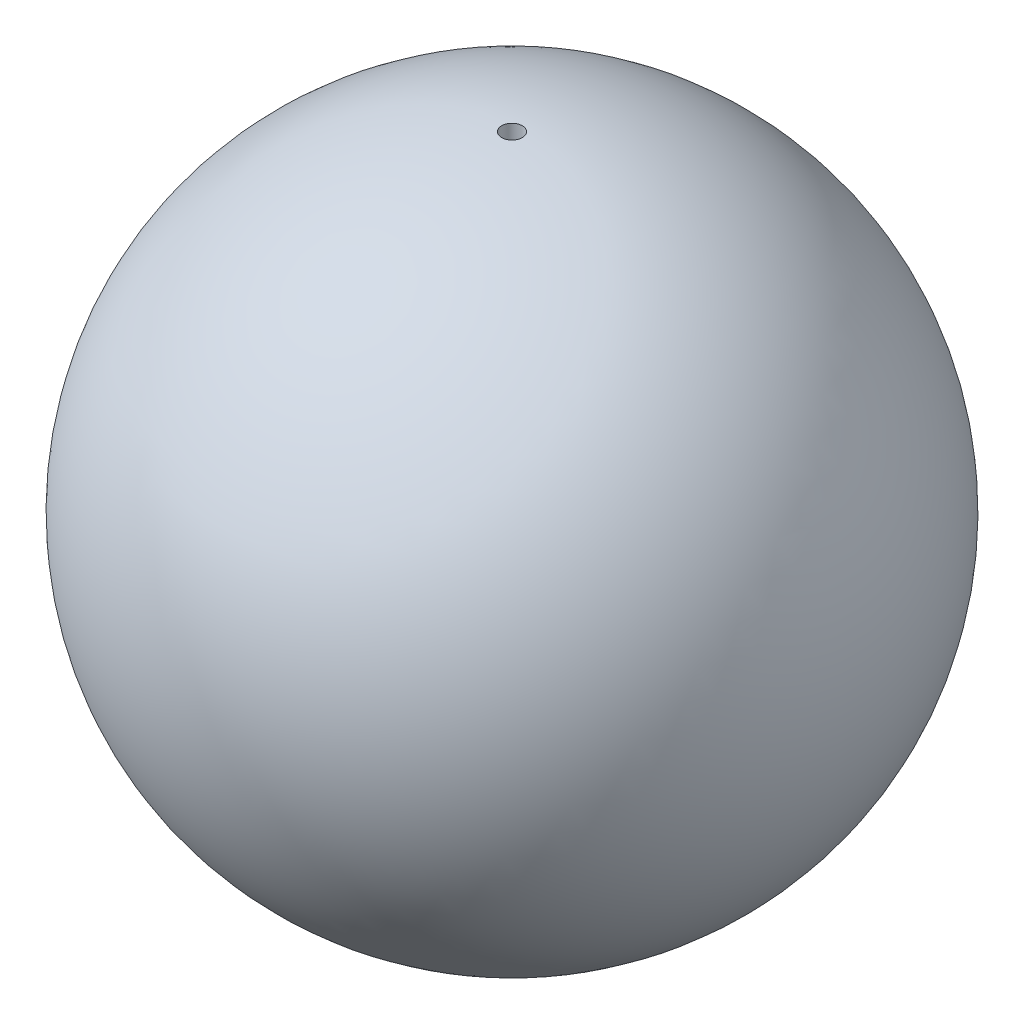
ISO-10303-21;
HEADER;
FILE_DESCRIPTION(('STEP AP214'),'2;1');
FILE_NAME('part.step','',(''),(''),'','','');
FILE_SCHEMA(('AUTOMOTIVE_DESIGN { 1 0 10303 214 1 1 1 1 }'));
ENDSEC;
DATA;
#1=APPLICATION_CONTEXT('core data for automotive mechanical design processes');
#2=APPLICATION_PROTOCOL_DEFINITION('international standard','automotive_design',2000,#1);
#3=PRODUCT_CONTEXT('',#1,'mechanical');
#4=PRODUCT('Part','Part','',(#3));
#5=PRODUCT_RELATED_PRODUCT_CATEGORY('part','',(#4));
#6=PRODUCT_DEFINITION_FORMATION('','',#4);
#7=PRODUCT_DEFINITION_CONTEXT('part definition',#1,'design');
#8=PRODUCT_DEFINITION('design','',#6,#7);
#9=PRODUCT_DEFINITION_SHAPE('','',#8);
#10=(LENGTH_UNIT() NAMED_UNIT(*) SI_UNIT(.MILLI.,.METRE.));
#11=(NAMED_UNIT(*) PLANE_ANGLE_UNIT() SI_UNIT($,.RADIAN.));
#12=(NAMED_UNIT(*) SI_UNIT($,.STERADIAN.) SOLID_ANGLE_UNIT());
#13=UNCERTAINTY_MEASURE_WITH_UNIT(LENGTH_MEASURE(1.E-05),#10,'distance_accuracy_value','');
#14=(GEOMETRIC_REPRESENTATION_CONTEXT(3) GLOBAL_UNCERTAINTY_ASSIGNED_CONTEXT((#13)) GLOBAL_UNIT_ASSIGNED_CONTEXT((#10,
#11,#12)) REPRESENTATION_CONTEXT('',''));
#15=CARTESIAN_POINT('',(0.,0.,0.));
#16=DIRECTION('',(0.,0.,1.));
#17=DIRECTION('',(1.,0.,0.));
#18=AXIS2_PLACEMENT_3D('',#15,#16,#17);
#19=CARTESIAN_POINT('',(0.,0.,0.));
#20=DIRECTION('',(0.,1.,0.));
#21=DIRECTION('',(1.,0.,0.));
#22=AXIS2_PLACEMENT_3D('',#19,#20,#21);
#23=SPHERICAL_SURFACE('',#22,203.2);
#24=CARTESIAN_POINT('',(0.,203.100757014837,0.));
#25=DIRECTION('',(0.,-1.,0.));
#26=DIRECTION('',(0.,0.,-1.));
#27=AXIS2_PLACEMENT_3D('',#24,#25,#26);
#28=CIRCLE('',#27,6.35);
#29=CARTESIAN_POINT('',(6.34999999999946,203.100757014837,0.));
#30=VERTEX_POINT('',#29);
#31=EDGE_CURVE('E10',#30,#30,#28,.F.);
#32=CARTESIAN_POINT('',(0.,-203.100757014837,0.));
#33=DIRECTION('',(0.,1.,0.));
#34=DIRECTION('',(0.,0.,1.));
#35=AXIS2_PLACEMENT_3D('',#32,#33,#34);
#36=CIRCLE('',#35,6.35);
#37=CARTESIAN_POINT('',(6.34999999999946,-203.100757014837,0.));
#38=VERTEX_POINT('',#37);
#39=EDGE_CURVE('E39',#38,#38,#36,.F.);
#40=CARTESIAN_POINT('',(6.34999999999946,203.100757014837,0.));
#41=CARTESIAN_POINT('',(7.97855225831806,203.049843962054,0.));
#42=CARTESIAN_POINT('',(9.60649168306472,202.979335242005,0.));
#43=CARTESIAN_POINT('',(12.8602038778124,202.799185124185,0.));
#44=CARTESIAN_POINT('',(14.4859766478133,202.689543726414,0.));
#45=CARTESIAN_POINT('',(17.7344145454678,202.431186909963,0.));
#46=CARTESIAN_POINT('',(19.3570796731212,202.282471491281,0.));
#47=CARTESIAN_POINT('',(22.5983634325835,201.946053966539,0.));
#48=CARTESIAN_POINT('',(24.2169820643923,201.758351860478,0.));
#49=CARTESIAN_POINT('',(27.4492362300853,201.344069227695,0.));
#50=CARTESIAN_POINT('',(29.0628717639695,201.117488700973,0.));
#51=CARTESIAN_POINT('',(32.2842260392271,200.625580425459,0.));
#52=CARTESIAN_POINT('',(33.8919447806004,200.360252676667,0.));
#53=CARTESIAN_POINT('',(37.1005351934276,199.791003459231,0.));
#54=CARTESIAN_POINT('',(38.7014068648815,199.487081990587,0.));
#55=CARTESIAN_POINT('',(41.8953768241203,198.840821198467,0.));
#56=CARTESIAN_POINT('',(43.4884751119052,198.49848187499,0.));
#57=CARTESIAN_POINT('',(46.665976487514,197.775583459607,0.));
#58=CARTESIAN_POINT('',(48.2503795753379,197.395024367701,0.));
#59=CARTESIAN_POINT('',(51.40957376617,196.595906619255,0.));
#60=CARTESIAN_POINT('',(52.9843648691782,196.177347962716,0.));
#61=CARTESIAN_POINT('',(56.123423867284,195.302473275927,0.));
#62=CARTESIAN_POINT('',(57.6876917623816,194.846157245677,0.));
#63=CARTESIAN_POINT('',(60.8047992106357,193.896031850142,0.));
#64=CARTESIAN_POINT('',(62.3576387637922,193.402222484857,0.));
#65=CARTESIAN_POINT('',(65.4509910069248,192.377396152691,0.));
#66=CARTESIAN_POINT('',(66.991503696901,191.846379185811,0.));
#67=CARTESIAN_POINT('',(70.0593108251408,190.747444913383,0.));
#68=CARTESIAN_POINT('',(71.5866052634044,190.179527607835,0.));
#69=CARTESIAN_POINT('',(74.6270921481781,189.007121272679,0.));
#70=CARTESIAN_POINT('',(76.1402845946881,188.402632243071,0.));
#71=CARTESIAN_POINT('',(79.1516919157645,187.157432235938,0.));
#72=CARTESIAN_POINT('',(80.6499067903308,186.516721258414,0.));
#73=CARTESIAN_POINT('',(83.6304920538181,185.199448090738,0.));
#74=CARTESIAN_POINT('',(85.1128624427392,184.522885900587,0.));
#75=CARTESIAN_POINT('',(88.0609009893466,183.134301787574,0.));
#76=CARTESIAN_POINT('',(89.5265691470329,182.422279864712,0.));
#77=CARTESIAN_POINT('',(92.4403551500115,180.963188284296,0.));
#78=CARTESIAN_POINT('',(93.8884729953038,180.216118626742,0.));
#79=CARTESIAN_POINT('',(96.7663204474914,178.68736385467,0.));
#80=CARTESIAN_POINT('',(98.1960500543867,177.905678740152,0.));
#81=CARTESIAN_POINT('',(101.036293743784,176.30814536146,0.));
#82=CARTESIAN_POINT('',(102.446807826285,175.492297097286,0.));
#83=CARTESIAN_POINT('',(105.247804299598,173.826909494449,0.));
#84=CARTESIAN_POINT('',(106.63828669041,172.977370155786,0.));
#85=CARTESIAN_POINT('',(109.398415204005,171.245091973843,0.));
#86=CARTESIAN_POINT('',(110.768061326788,170.362353130563,0.));
#87=CARTESIAN_POINT('',(113.485724784503,168.564186719522,0.));
#88=CARTESIAN_POINT('',(114.833742119434,167.648759151761,0.));
#89=CARTESIAN_POINT('',(117.507367996708,165.785744986606,0.));
#90=CARTESIAN_POINT('',(118.832976539051,164.838158389213,0.));
#91=CARTESIAN_POINT('',(121.461017792836,162.911374467856,0.));
#92=CARTESIAN_POINT('',(122.763450504279,161.932177143893,0.));
#93=CARTESIAN_POINT('',(125.344386468208,159.94273836341,0.));
#94=CARTESIAN_POINT('',(126.622889720695,158.932496906889,0.));
#95=CARTESIAN_POINT('',(129.155226984986,156.881554418403,0.));
#96=CARTESIAN_POINT('',(130.409060996791,155.840853386438,0.));
#97=CARTESIAN_POINT('',(132.89133427238,153.72959392903,0.));
#98=CARTESIAN_POINT('',(134.119773536164,152.659035503588,0.));
#99=CARTESIAN_POINT('',(136.550546502567,150.488680717614,0.));
#100=CARTESIAN_POINT('',(137.752880205185,149.388884357082,0.));
#101=CARTESIAN_POINT('',(140.130746341598,147.160690077291,0.));
#102=CARTESIAN_POINT('',(141.306278775393,146.032292158031,0.));
#103=CARTESIAN_POINT('',(143.629862174549,143.747547686901,0.));
#104=CARTESIAN_POINT('',(144.77791313991,142.591201135029,0.));
#105=CARTESIAN_POINT('',(147.045869304221,140.251228496736,0.));
#106=CARTESIAN_POINT('',(148.165774503171,139.067602410315,0.));
#107=CARTESIAN_POINT('',(150.376791122696,136.673755585771,0.));
#108=CARTESIAN_POINT('',(151.467902543271,135.463534847648,0.));
#109=CARTESIAN_POINT('',(153.62070025506,133.017198991043,0.));
#110=CARTESIAN_POINT('',(154.682386546274,131.781083872561,0.));
#111=CARTESIAN_POINT('',(156.775719674647,129.283674509871,0.));
#112=CARTESIAN_POINT('',(157.807366511807,128.022380265664,0.));
#113=CARTESIAN_POINT('',(159.84002378914,125.475342475583,0.));
#114=CARTESIAN_POINT('',(160.841034229314,124.18959892971,0.));
#115=CARTESIAN_POINT('',(162.811839496919,121.594406507484,0.));
#116=CARTESIAN_POINT('',(163.781634324349,120.284957631131,0.));
#117=CARTESIAN_POINT('',(165.689447213029,117.643112235772,0.));
#118=CARTESIAN_POINT('',(166.62746527428,116.310715716766,0.));
#119=CARTESIAN_POINT('',(168.471181864191,113.623746002147,0.));
#120=CARTESIAN_POINT('',(169.376880392852,112.269172806534,0.));
#121=CARTESIAN_POINT('',(171.155433852259,109.538633536861,0.));
#122=CARTESIAN_POINT('',(172.028288783006,108.162667462801,0.));
#123=CARTESIAN_POINT('',(173.740649985588,105.390138612981,0.));
#124=CARTESIAN_POINT('',(174.580156257423,103.99357583722,0.));
#125=CARTESIAN_POINT('',(176.225334377755,101.180661678634,0.));
#126=CARTESIAN_POINT('',(177.031006226253,99.7643102958083,0.));
#127=CARTESIAN_POINT('',(178.608049313131,96.9126384680338,0.));
#128=CARTESIAN_POINT('',(179.379420551513,95.4773180230845,0.));
#129=CARTESIAN_POINT('',(180.887416078783,92.5885385920912,0.));
#130=CARTESIAN_POINT('',(181.624040367671,91.1350796060471,0.));
#131=CARTESIAN_POINT('',(183.06211576224,88.2108641094173,0.));
#132=CARTESIAN_POINT('',(183.763566867921,86.7401075988316,0.));
#133=CARTESIAN_POINT('',(185.130890014661,83.7821480785568,0.));
#134=CARTESIAN_POINT('',(185.79676205572,82.2949450688677,0.));
#135=CARTESIAN_POINT('',(187.092541778952,79.3049530922806,0.));
#136=CARTESIAN_POINT('',(187.722449461126,77.8021641253824,0.));
#137=CARTESIAN_POINT('',(188.94593598242,74.7818697947905,0.));
#138=CARTESIAN_POINT('',(189.539514821541,73.2643644310967,0.));
#139=CARTESIAN_POINT('',(190.690000193562,70.2155153826915,0.));
#140=CARTESIAN_POINT('',(191.246906726462,68.6841716979802,0.));
#141=CARTESIAN_POINT('',(192.323725242609,65.608532090601,0.));
#142=CARTESIAN_POINT('',(192.843637225855,64.0642361679331,0.));
#143=CARTESIAN_POINT('',(193.846165805458,60.963585662269,0.));
#144=CARTESIAN_POINT('',(194.328782401814,59.4072310792729,0.));
#145=CARTESIAN_POINT('',(195.256440950672,56.2833638080966,0.));
#146=CARTESIAN_POINT('',(195.701482903173,54.7158511199164,0.));
#147=CARTESIAN_POINT('',(196.553734649211,51.5705746499427,0.));
#148=CARTESIAN_POINT('',(196.960944442748,49.9928108681491,0.));
#149=CARTESIAN_POINT('',(197.737296246612,46.8279451541207,0.));
#150=CARTESIAN_POINT('',(198.106438256939,45.2408432218859,0.));
#151=CARTESIAN_POINT('',(198.806440897341,42.0582195534913,0.));
#152=CARTESIAN_POINT('',(199.137301527416,40.4626978173316,0.));
#153=CARTESIAN_POINT('',(199.760549961068,37.2641577595636,0.));
#154=CARTESIAN_POINT('',(200.052937764644,35.6611394379553,0.));
#155=CARTESIAN_POINT('',(200.599071360626,32.4485337655244,0.));
#156=CARTESIAN_POINT('',(200.852817153031,30.8389464147017,0.));
#157=CARTESIAN_POINT('',(201.321519901467,27.6141340411203,0.));
#158=CARTESIAN_POINT('',(201.536476857498,25.9989090183616,0.));
#159=CARTESIAN_POINT('',(201.927477552407,22.7637559203188,0.));
#160=CARTESIAN_POINT('',(202.103521291286,21.1438278450348,0.));
#161=CARTESIAN_POINT('',(202.416593687512,17.9002059826845,0.));
#162=CARTESIAN_POINT('',(202.553622344859,16.2765121956182,0.));
#163=CARTESIAN_POINT('',(202.78858528898,13.0262984294045,0.));
#164=CARTESIAN_POINT('',(202.886519575754,11.3997784502571,0.));
#165=CARTESIAN_POINT('',(203.043237110907,8.14485345490447,0.));
#166=CARTESIAN_POINT('',(203.102020359285,6.51644843869936,0.));
#167=CARTESIAN_POINT('',(203.180401803832,3.25869561499617,0.));
#168=CARTESIAN_POINT('',(203.2,1.62934780749808,0.));
#169=CARTESIAN_POINT('',(203.2,-1.62934780749808,0.));
#170=CARTESIAN_POINT('',(203.180401803832,-3.25869561499617,0.));
#171=CARTESIAN_POINT('',(203.102020359285,-6.51644843869936,0.));
#172=CARTESIAN_POINT('',(203.043237110907,-8.14485345490447,0.));
#173=CARTESIAN_POINT('',(202.886519575754,-11.3997784502571,0.));
#174=CARTESIAN_POINT('',(202.78858528898,-13.0262984294045,0.));
#175=CARTESIAN_POINT('',(202.553622344859,-16.2765121956182,0.));
#176=CARTESIAN_POINT('',(202.416593687512,-17.9002059826845,0.));
#177=CARTESIAN_POINT('',(202.103521291286,-21.1438278450348,0.));
#178=CARTESIAN_POINT('',(201.927477552407,-22.7637559203188,0.));
#179=CARTESIAN_POINT('',(201.536476857498,-25.9989090183616,0.));
#180=CARTESIAN_POINT('',(201.321519901467,-27.6141340411203,0.));
#181=CARTESIAN_POINT('',(200.852817153031,-30.8389464147017,0.));
#182=CARTESIAN_POINT('',(200.599071360626,-32.4485337655244,0.));
#183=CARTESIAN_POINT('',(200.052937764644,-35.6611394379553,0.));
#184=CARTESIAN_POINT('',(199.760549961068,-37.2641577595636,0.));
#185=CARTESIAN_POINT('',(199.137301527416,-40.4626978173316,0.));
#186=CARTESIAN_POINT('',(198.806440897341,-42.0582195534913,0.));
#187=CARTESIAN_POINT('',(198.106438256939,-45.2408432218859,0.));
#188=CARTESIAN_POINT('',(197.737296246612,-46.8279451541207,0.));
#189=CARTESIAN_POINT('',(196.960944442748,-49.9928108681491,0.));
#190=CARTESIAN_POINT('',(196.553734649211,-51.5705746499427,0.));
#191=CARTESIAN_POINT('',(195.701482903173,-54.7158511199164,0.));
#192=CARTESIAN_POINT('',(195.256440950672,-56.2833638080966,0.));
#193=CARTESIAN_POINT('',(194.328782401814,-59.4072310792729,0.));
#194=CARTESIAN_POINT('',(193.846165805458,-60.963585662269,0.));
#195=CARTESIAN_POINT('',(192.843637225855,-64.0642361679331,0.));
#196=CARTESIAN_POINT('',(192.323725242609,-65.608532090601,0.));
#197=CARTESIAN_POINT('',(191.246906726462,-68.6841716979802,0.));
#198=CARTESIAN_POINT('',(190.690000193562,-70.2155153826915,0.));
#199=CARTESIAN_POINT('',(189.539514821541,-73.2643644310967,0.));
#200=CARTESIAN_POINT('',(188.94593598242,-74.7818697947905,0.));
#201=CARTESIAN_POINT('',(187.722449461126,-77.8021641253824,0.));
#202=CARTESIAN_POINT('',(187.092541778952,-79.3049530922806,0.));
#203=CARTESIAN_POINT('',(185.79676205572,-82.2949450688677,0.));
#204=CARTESIAN_POINT('',(185.130890014661,-83.7821480785568,0.));
#205=CARTESIAN_POINT('',(183.763566867921,-86.7401075988316,0.));
#206=CARTESIAN_POINT('',(183.06211576224,-88.2108641094173,0.));
#207=CARTESIAN_POINT('',(181.624040367671,-91.1350796060471,0.));
#208=CARTESIAN_POINT('',(180.887416078783,-92.5885385920911,0.));
#209=CARTESIAN_POINT('',(179.379420551513,-95.4773180230844,0.));
#210=CARTESIAN_POINT('',(178.608049313131,-96.9126384680337,0.));
#211=CARTESIAN_POINT('',(177.031006226253,-99.7643102958083,0.));
#212=CARTESIAN_POINT('',(176.225334377755,-101.180661678634,0.));
#213=CARTESIAN_POINT('',(174.580156257423,-103.99357583722,0.));
#214=CARTESIAN_POINT('',(173.740649985588,-105.390138612981,0.));
#215=CARTESIAN_POINT('',(172.028288783006,-108.162667462801,0.));
#216=CARTESIAN_POINT('',(171.155433852259,-109.538633536861,0.));
#217=CARTESIAN_POINT('',(169.376880392852,-112.269172806534,0.));
#218=CARTESIAN_POINT('',(168.471181864191,-113.623746002147,0.));
#219=CARTESIAN_POINT('',(166.62746527428,-116.310715716766,0.));
#220=CARTESIAN_POINT('',(165.689447213029,-117.643112235772,0.));
#221=CARTESIAN_POINT('',(163.781634324349,-120.284957631131,0.));
#222=CARTESIAN_POINT('',(162.811839496919,-121.594406507484,0.));
#223=CARTESIAN_POINT('',(160.841034229314,-124.18959892971,0.));
#224=CARTESIAN_POINT('',(159.84002378914,-125.475342475583,0.));
#225=CARTESIAN_POINT('',(157.807366511807,-128.022380265664,0.));
#226=CARTESIAN_POINT('',(156.775719674647,-129.283674509871,0.));
#227=CARTESIAN_POINT('',(154.682386546274,-131.781083872561,0.));
#228=CARTESIAN_POINT('',(153.62070025506,-133.017198991043,0.));
#229=CARTESIAN_POINT('',(151.467902543271,-135.463534847648,0.));
#230=CARTESIAN_POINT('',(150.376791122696,-136.673755585771,0.));
#231=CARTESIAN_POINT('',(148.165774503171,-139.067602410315,0.));
#232=CARTESIAN_POINT('',(147.045869304221,-140.251228496736,0.));
#233=CARTESIAN_POINT('',(144.77791313991,-142.591201135029,0.));
#234=CARTESIAN_POINT('',(143.629862174549,-143.747547686901,0.));
#235=CARTESIAN_POINT('',(141.306278775393,-146.032292158031,0.));
#236=CARTESIAN_POINT('',(140.130746341598,-147.160690077291,0.));
#237=CARTESIAN_POINT('',(137.752880205185,-149.388884357082,0.));
#238=CARTESIAN_POINT('',(136.550546502567,-150.488680717614,0.));
#239=CARTESIAN_POINT('',(134.119773536164,-152.659035503588,0.));
#240=CARTESIAN_POINT('',(132.89133427238,-153.72959392903,0.));
#241=CARTESIAN_POINT('',(130.409060996791,-155.840853386438,0.));
#242=CARTESIAN_POINT('',(129.155226984986,-156.881554418403,0.));
#243=CARTESIAN_POINT('',(126.622889720695,-158.932496906889,0.));
#244=CARTESIAN_POINT('',(125.344386468208,-159.94273836341,0.));
#245=CARTESIAN_POINT('',(122.763450504279,-161.932177143893,0.));
#246=CARTESIAN_POINT('',(121.461017792836,-162.911374467856,0.));
#247=CARTESIAN_POINT('',(118.832976539051,-164.838158389213,0.));
#248=CARTESIAN_POINT('',(117.507367996708,-165.785744986606,0.));
#249=CARTESIAN_POINT('',(114.833742119434,-167.648759151761,0.));
#250=CARTESIAN_POINT('',(113.485724784503,-168.564186719522,0.));
#251=CARTESIAN_POINT('',(110.768061326788,-170.362353130563,0.));
#252=CARTESIAN_POINT('',(109.398415204005,-171.245091973843,0.));
#253=CARTESIAN_POINT('',(106.63828669041,-172.977370155786,0.));
#254=CARTESIAN_POINT('',(105.247804299598,-173.826909494449,0.));
#255=CARTESIAN_POINT('',(102.446807826285,-175.492297097286,0.));
#256=CARTESIAN_POINT('',(101.036293743784,-176.30814536146,0.));
#257=CARTESIAN_POINT('',(98.1960500543866,-177.905678740152,0.));
#258=CARTESIAN_POINT('',(96.7663204474914,-178.68736385467,0.));
#259=CARTESIAN_POINT('',(93.8884729953038,-180.216118626742,0.));
#260=CARTESIAN_POINT('',(92.4403551500115,-180.963188284296,0.));
#261=CARTESIAN_POINT('',(89.5265691470329,-182.422279864712,0.));
#262=CARTESIAN_POINT('',(88.0609009893465,-183.134301787574,0.));
#263=CARTESIAN_POINT('',(85.1128624427392,-184.522885900587,0.));
#264=CARTESIAN_POINT('',(83.6304920538181,-185.199448090738,0.));
#265=CARTESIAN_POINT('',(80.6499067903308,-186.516721258414,0.));
#266=CARTESIAN_POINT('',(79.1516919157645,-187.157432235938,0.));
#267=CARTESIAN_POINT('',(76.1402845946881,-188.402632243071,0.));
#268=CARTESIAN_POINT('',(74.6270921481781,-189.007121272679,0.));
#269=CARTESIAN_POINT('',(71.5866052634044,-190.179527607835,0.));
#270=CARTESIAN_POINT('',(70.0593108251408,-190.747444913383,0.));
#271=CARTESIAN_POINT('',(66.991503696901,-191.846379185811,0.));
#272=CARTESIAN_POINT('',(65.4509910069248,-192.377396152691,0.));
#273=CARTESIAN_POINT('',(62.3576387637921,-193.402222484857,0.));
#274=CARTESIAN_POINT('',(60.8047992106357,-193.896031850142,0.));
#275=CARTESIAN_POINT('',(57.6876917623816,-194.846157245677,0.));
#276=CARTESIAN_POINT('',(56.123423867284,-195.302473275927,0.));
#277=CARTESIAN_POINT('',(52.9843648691782,-196.177347962716,0.));
#278=CARTESIAN_POINT('',(51.40957376617,-196.595906619255,0.));
#279=CARTESIAN_POINT('',(48.2503795753379,-197.395024367701,0.));
#280=CARTESIAN_POINT('',(46.665976487514,-197.775583459607,0.));
#281=CARTESIAN_POINT('',(43.4884751119052,-198.49848187499,0.));
#282=CARTESIAN_POINT('',(41.8953768241203,-198.840821198467,0.));
#283=CARTESIAN_POINT('',(38.7014068648815,-199.487081990587,0.));
#284=CARTESIAN_POINT('',(37.1005351934276,-199.791003459231,0.));
#285=CARTESIAN_POINT('',(33.8919447806004,-200.360252676667,0.));
#286=CARTESIAN_POINT('',(32.284226039227,-200.625580425459,0.));
#287=CARTESIAN_POINT('',(29.0628717639695,-201.117488700973,0.));
#288=CARTESIAN_POINT('',(27.4492362300853,-201.344069227695,0.));
#289=CARTESIAN_POINT('',(24.2169820643923,-201.758351860478,0.));
#290=CARTESIAN_POINT('',(22.5983634325835,-201.946053966539,0.));
#291=CARTESIAN_POINT('',(19.3570796731212,-202.282471491281,0.));
#292=CARTESIAN_POINT('',(17.7344145454678,-202.431186909963,0.));
#293=CARTESIAN_POINT('',(14.4859766478133,-202.689543726414,0.));
#294=CARTESIAN_POINT('',(12.8602038778124,-202.799185124185,0.));
#295=CARTESIAN_POINT('',(9.60649168306475,-202.979335242005,0.));
#296=CARTESIAN_POINT('',(7.97855225831807,-203.049843962054,0.));
#297=CARTESIAN_POINT('',(6.34999999999946,-203.100757014837,0.));
#298=B_SPLINE_CURVE_WITH_KNOTS('',3,(#40,#41,#42,#43,#44,#45,#46,#47,#48,#49,#50,#51,#52,#53,
#54,#55,#56,#57,#58,#59,#60,#61,#62,#63,#64,#65,#66,#67,#68,#69,#70,#71,#72,#73,#74,#75,#76,#77,
#78,#79,#80,#81,#82,#83,#84,#85,#86,#87,#88,#89,#90,#91,#92,#93,#94,#95,#96,#97,#98,#99,#100,
#101,#102,#103,#104,#105,#106,#107,#108,#109,#110,#111,#112,#113,#114,#115,#116,#117,#118,#119,
#120,#121,#122,#123,#124,#125,#126,#127,#128,#129,#130,#131,#132,#133,#134,#135,#136,#137,#138,
#139,#140,#141,#142,#143,#144,#145,#146,#147,#148,#149,#150,#151,#152,#153,#154,#155,#156,#157,
#158,#159,#160,#161,#162,#163,#164,#165,#166,#167,#168,#169,#170,#171,#172,#173,#174,#175,#176,
#177,#178,#179,#180,#181,#182,#183,#184,#185,#186,#187,#188,#189,#190,#191,#192,#193,#194,#195,
#196,#197,#198,#199,#200,#201,#202,#203,#204,#205,#206,#207,#208,#209,#210,#211,#212,#213,#214,
#215,#216,#217,#218,#219,#220,#221,#222,#223,#224,#225,#226,#227,#228,#229,#230,#231,#232,#233,
#234,#235,#236,#237,#238,#239,#240,#241,#242,#243,#244,#245,#246,#247,#248,#249,#250,#251,#252,
#253,#254,#255,#256,#257,#258,#259,#260,#261,#262,#263,#264,#265,#266,#267,#268,#269,#270,#271,
#272,#273,#274,#275,#276,#277,#278,#279,#280,#281,#282,#283,#284,#285,#286,#287,#288,#289,#290,
#291,#292,#293,#294,#295,#296,#297),.UNSPECIFIED.,.F.,.F.,(4,2,2,2,2,2,2,2,2,2,2,2,2,2,2,2,2,2,
2,2,2,2,2,2,2,2,2,2,2,2,2,2,2,2,2,2,2,2,2,2,2,2,2,2,2,2,2,2,2,2,2,2,2,2,2,2,2,2,2,2,2,2,2,2,2,2,
2,2,2,2,2,2,2,2,2,2,2,2,2,2,2,2,2,2,2,2,2,2,2,2,2,2,2,2,2,2,2,2,2,2,2,2,2,2,2,2,2,2,2,2,2,2,2,2,
2,2,2,2,2,2,2,2,2,2,2,2,2,2,4),(0.,4.88792557784549,9.77585115569103,14.6637767335365,
19.551702311382,24.4396278892275,29.327553467073,34.2154790449185,39.1034046227641,
43.9913302006096,48.8792557784551,53.7671813563006,58.6551069341461,63.5430325119916,
68.4309580898371,73.3188836676826,78.2068092455281,83.0947348233737,87.9826604012191,
92.8705859790647,97.7585115569102,102.646437134756,107.534362712601,112.422288290447,
117.310213868292,122.198139446138,127.086065023983,131.973990601829,136.861916179674,
141.74984175752,146.637767335365,151.525692913211,156.413618491056,161.301544068902,
166.189469646747,171.077395224593,175.965320802438,180.853246380284,185.741171958129,
190.629097535975,195.51702311382,200.404948691666,205.292874269511,210.180799847357,
215.068725425202,219.956651003048,224.844576580893,229.732502158739,234.620427736584,
239.50835331443,244.396278892275,249.284204470121,254.172130047966,259.060055625812,
263.947981203658,268.835906781503,273.723832359349,278.611757937194,283.49968351504,
288.387609092885,293.275534670731,298.163460248576,303.051385826422,307.939311404267,
312.827236982113,317.715162559958,322.603088137804,327.491013715649,332.378939293495,
337.26686487134,342.154790449186,347.042716027031,351.930641604877,356.818567182722,
361.706492760568,366.594418338413,371.482343916259,376.370269494104,381.25819507195,
386.146120649795,391.034046227641,395.921971805487,400.809897383332,405.697822961178,
410.585748539023,415.473674116868,420.361599694714,425.249525272559,430.137450850405,
435.02537642825,439.913302006096,444.801227583941,449.689153161787,454.577078739632,
459.465004317478,464.352929895323,469.240855473169,474.128781051014,479.01670662886,
483.904632206706,488.792557784551,493.680483362397,498.568408940242,503.456334518088,
508.344260095933,513.232185673779,518.120111251624,523.00803682947,527.895962407315,
532.783887985161,537.671813563006,542.559739140852,547.447664718697,552.335590296543,
557.223515874388,562.111441452234,566.999367030079,571.887292607925,576.775218185771,
581.663143763616,586.551069341462,591.438994919307,596.326920497153,601.214846074998,
606.102771652844,610.990697230689,615.878622808535,620.76654838638,625.654473964226),.UNSPECIFIED.);
#299=EDGE_CURVE('BSEAM33',#30,#38,#298,.T.);
#300=ORIENTED_EDGE('',*,*,#31,.F.);
#301=ORIENTED_EDGE('',*,*,#39,.F.);
#302=ORIENTED_EDGE('',*,*,#299,.T.);
#303=ORIENTED_EDGE('',*,*,#299,.F.);
#304=EDGE_LOOP('',(#300,#302,#301,#303));
#305=FACE_BOUND('',#304,.T.);
#306=ADVANCED_FACE('F33',(#305),#23,.T.);
#307=CARTESIAN_POINT('',(0.,-203.2,0.));
#308=DIRECTION('',(0.,1.,0.));
#309=DIRECTION('',(0.,0.,1.));
#310=AXIS2_PLACEMENT_3D('',#307,#308,#309);
#311=CYLINDRICAL_SURFACE('',#310,6.35);
#312=ORIENTED_EDGE('',*,*,#31,.T.);
#313=EDGE_LOOP('',(#312));
#314=FACE_BOUND('',#313,.T.);
#315=ORIENTED_EDGE('',*,*,#39,.T.);
#316=EDGE_LOOP('',(#315));
#317=FACE_BOUND('',#316,.T.);
#318=ADVANCED_FACE('F45',(#314,#317),#311,.F.);
#319=CLOSED_SHELL('',(#306,#318));
#320=MANIFOLD_SOLID_BREP('B2',#319);
#321=ADVANCED_BREP_SHAPE_REPRESENTATION('',(#18,#320),#14);
#322=SHAPE_DEFINITION_REPRESENTATION(#9,#321);
ENDSEC;
END-ISO-10303-21;
